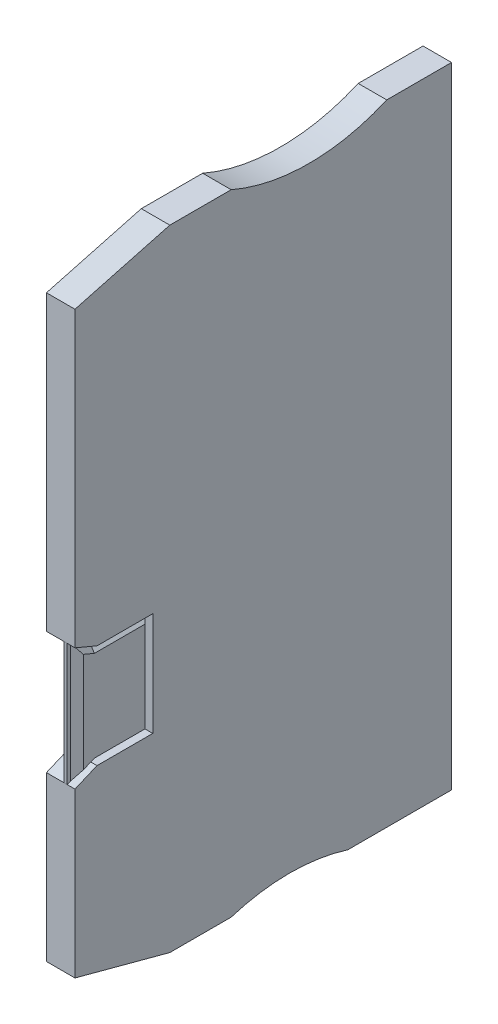
ISO-10303-21;
HEADER;
FILE_DESCRIPTION(('STEP AP214'),'2;1');
FILE_NAME('part.step','',(''),(''),'','','');
FILE_SCHEMA(('AUTOMOTIVE_DESIGN { 1 0 10303 214 1 1 1 1 }'));
ENDSEC;
DATA;
#1=APPLICATION_CONTEXT('core data for automotive mechanical design processes');
#2=APPLICATION_PROTOCOL_DEFINITION('international standard','automotive_design',2000,#1);
#3=PRODUCT_CONTEXT('',#1,'mechanical');
#4=PRODUCT('Part','Part','',(#3));
#5=PRODUCT_RELATED_PRODUCT_CATEGORY('part','',(#4));
#6=PRODUCT_DEFINITION_FORMATION('','',#4);
#7=PRODUCT_DEFINITION_CONTEXT('part definition',#1,'design');
#8=PRODUCT_DEFINITION('design','',#6,#7);
#9=PRODUCT_DEFINITION_SHAPE('','',#8);
#10=(LENGTH_UNIT() NAMED_UNIT(*) SI_UNIT(.MILLI.,.METRE.));
#11=(NAMED_UNIT(*) PLANE_ANGLE_UNIT() SI_UNIT($,.RADIAN.));
#12=(NAMED_UNIT(*) SI_UNIT($,.STERADIAN.) SOLID_ANGLE_UNIT());
#13=UNCERTAINTY_MEASURE_WITH_UNIT(LENGTH_MEASURE(1.E-05),#10,'distance_accuracy_value','');
#14=(GEOMETRIC_REPRESENTATION_CONTEXT(3) GLOBAL_UNCERTAINTY_ASSIGNED_CONTEXT((#13)) GLOBAL_UNIT_ASSIGNED_CONTEXT((#10,
#11,#12)) REPRESENTATION_CONTEXT('',''));
#15=CARTESIAN_POINT('',(0.,0.,0.));
#16=DIRECTION('',(0.,0.,1.));
#17=DIRECTION('',(1.,0.,0.));
#18=AXIS2_PLACEMENT_3D('',#15,#16,#17);
#19=CARTESIAN_POINT('',(0.,24.0184997192853,29.0499999999897));
#20=DIRECTION('',(0.,-0.921109330016461,0.389303997098189));
#21=DIRECTION('',(1.,0.,0.));
#22=AXIS2_PLACEMENT_3D('',#19,#20,#21);
#23=PLANE('',#22);
#24=DIRECTION('',(0.,0.389303997098189,0.921109330016461));
#25=VECTOR('',#24,1.);
#26=CARTESIAN_POINT('',(1.60000000002042,13.5638524803379,4.3138729999976));
#27=LINE('',#26,#25);
#28=CARTESIAN_POINT('',(1.6000000000205,23.2999999999824,27.3499999999967));
#29=VERTEX_POINT('',#28);
#30=CARTESIAN_POINT('',(1.6000000000051,23.9168213078739,28.8094246806752));
#31=VERTEX_POINT('',#30);
#32=EDGE_CURVE('P0_E154',#29,#31,#27,.T.);
#33=ORIENTED_EDGE('',*,*,#32,.F.);
#34=DIRECTION('',(-1.,0.,0.));
#35=VECTOR('',#34,1.);
#36=CARTESIAN_POINT('',(0.,23.3,27.350000000039));
#37=LINE('',#36,#35);
#38=CARTESIAN_POINT('',(1.34999999997115,23.3,27.350000000039));
#39=VERTEX_POINT('',#38);
#40=EDGE_CURVE('P0_E28',#29,#39,#37,.T.);
#41=ORIENTED_EDGE('',*,*,#40,.T.);
#42=DIRECTION('',(0.,0.389303997098189,0.921109330016461));
#43=VECTOR('',#42,1.);
#44=CARTESIAN_POINT('',(1.34999999997091,13.5638524803379,4.3138729999976));
#45=LINE('',#44,#43);
#46=CARTESIAN_POINT('',(1.34999999997371,24.0184997192853,29.0499999999831));
#47=VERTEX_POINT('',#46);
#48=EDGE_CURVE('P0_E208',#39,#47,#45,.T.);
#49=ORIENTED_EDGE('',*,*,#48,.T.);
#50=DIRECTION('',(1.,0.,0.));
#51=VECTOR('',#50,1.);
#52=CARTESIAN_POINT('',(0.,24.0184997192853,29.0499999999897));
#53=LINE('',#52,#51);
#54=CARTESIAN_POINT('',(1.60000000000003,24.0184997192853,29.0499999999897));
#55=VERTEX_POINT('',#54);
#56=EDGE_CURVE('P0_E217',#47,#55,#53,.T.);
#57=ORIENTED_EDGE('',*,*,#56,.T.);
#58=DIRECTION('',(0.,0.389303997098189,0.921109330016461));
#59=VECTOR('',#58,1.);
#60=CARTESIAN_POINT('',(1.59999999999992,13.5638524803379,4.3138729999976));
#61=LINE('',#60,#59);
#62=EDGE_CURVE('P0_E194',#31,#55,#61,.T.);
#63=ORIENTED_EDGE('',*,*,#62,.F.);
#64=EDGE_LOOP('',(#33,#41,#49,#57,#63));
#65=FACE_BOUND('',#64,.T.);
#66=ADVANCED_FACE('P0_F17',(#65),#23,.F.);
#67=CARTESIAN_POINT('',(0.,23.3,23.0499999999897));
#68=DIRECTION('',(0.,0.,1.));
#69=DIRECTION('',(0.,1.,0.));
#70=AXIS2_PLACEMENT_3D('',#67,#68,#69);
#71=PLANE('',#70);
#72=DIRECTION('',(0.,1.,0.));
#73=VECTOR('',#72,1.);
#74=CARTESIAN_POINT('',(1.59999999999974,36.2906041739485,23.0499999999897));
#75=LINE('',#74,#73);
#76=CARTESIAN_POINT('',(1.60000000000007,15.3000000000005,23.0499999999897));
#77=VERTEX_POINT('',#76);
#78=CARTESIAN_POINT('',(1.6,23.3,23.0499999999897));
#79=VERTEX_POINT('',#78);
#80=EDGE_CURVE('P0_E229',#77,#79,#75,.T.);
#81=ORIENTED_EDGE('',*,*,#80,.F.);
#82=DIRECTION('',(-1.,0.,0.));
#83=VECTOR('',#82,1.);
#84=CARTESIAN_POINT('',(0.,15.3000000000005,23.0499999999897));
#85=LINE('',#84,#83);
#86=CARTESIAN_POINT('',(1.35000000000015,15.3000000000005,23.0499999999897));
#87=VERTEX_POINT('',#86);
#88=EDGE_CURVE('P0_E195',#77,#87,#85,.T.);
#89=ORIENTED_EDGE('',*,*,#88,.T.);
#90=DIRECTION('',(0.,1.,0.));
#91=VECTOR('',#90,1.);
#92=CARTESIAN_POINT('',(1.34999999999979,36.2906041739485,23.0499999999897));
#93=LINE('',#92,#91);
#94=CARTESIAN_POINT('',(1.34999999999996,23.3,23.0499999999897));
#95=VERTEX_POINT('',#94);
#96=EDGE_CURVE('P0_E153',#87,#95,#93,.T.);
#97=ORIENTED_EDGE('',*,*,#96,.T.);
#98=DIRECTION('',(-1.,0.,0.));
#99=VECTOR('',#98,1.);
#100=CARTESIAN_POINT('',(0.,23.3,23.0499999999897));
#101=LINE('',#100,#99);
#102=EDGE_CURVE('P0_E11',#79,#95,#101,.T.);
#103=ORIENTED_EDGE('',*,*,#102,.F.);
#104=EDGE_LOOP('',(#81,#89,#97,#103));
#105=FACE_BOUND('',#104,.T.);
#106=ADVANCED_FACE('P0_F366',(#105),#71,.F.);
#107=CARTESIAN_POINT('',(0.,23.3,27.350000000039));
#108=DIRECTION('',(0.,-1.,0.));
#109=DIRECTION('',(1.,0.,0.));
#110=AXIS2_PLACEMENT_3D('',#107,#108,#109);
#111=PLANE('',#110);
#112=DIRECTION('',(0.,0.,1.));
#113=VECTOR('',#112,1.);
#114=CARTESIAN_POINT('',(1.34999999999448,23.3,4.31387299999759));
#115=LINE('',#114,#113);
#116=EDGE_CURVE('P0_E219',#95,#39,#115,.T.);
#117=ORIENTED_EDGE('',*,*,#116,.T.);
#118=ORIENTED_EDGE('',*,*,#40,.F.);
#119=DIRECTION('',(0.,0.,1.));
#120=VECTOR('',#119,1.);
#121=CARTESIAN_POINT('',(1.59999999999985,23.3,4.31387299999759));
#122=LINE('',#121,#120);
#123=EDGE_CURVE('P0_E148',#79,#29,#122,.T.);
#124=ORIENTED_EDGE('',*,*,#123,.F.);
#125=ORIENTED_EDGE('',*,*,#102,.T.);
#126=EDGE_LOOP('',(#117,#118,#124,#125));
#127=FACE_BOUND('',#126,.T.);
#128=ADVANCED_FACE('P0_F364',(#127),#111,.F.);
#129=CARTESIAN_POINT('',(0.,15.3000000000005,23.0499999999897));
#130=DIRECTION('',(0.,1.,0.));
#131=DIRECTION('',(0.,0.,1.));
#132=AXIS2_PLACEMENT_3D('',#129,#130,#131);
#133=PLANE('',#132);
#134=DIRECTION('',(0.,0.,-1.));
#135=VECTOR('',#134,1.);
#136=CARTESIAN_POINT('',(1.59999999999976,15.3000000000007,4.3138729999976));
#137=LINE('',#136,#135);
#138=CARTESIAN_POINT('',(1.60000000000015,15.3000000000005,27.3499999999863));
#139=VERTEX_POINT('',#138);
#140=EDGE_CURVE('P0_E289',#139,#77,#137,.T.);
#141=ORIENTED_EDGE('',*,*,#140,.F.);
#142=DIRECTION('',(-1.,0.,0.));
#143=VECTOR('',#142,1.);
#144=CARTESIAN_POINT('',(0.,15.3000000000005,27.3499999999862));
#145=LINE('',#144,#143);
#146=CARTESIAN_POINT('',(1.35000000000018,15.3000000000005,27.3499999999863));
#147=VERTEX_POINT('',#146);
#148=EDGE_CURVE('P0_E41',#139,#147,#145,.T.);
#149=ORIENTED_EDGE('',*,*,#148,.T.);
#150=DIRECTION('',(0.,0.,-1.));
#151=VECTOR('',#150,1.);
#152=CARTESIAN_POINT('',(1.34999999999997,15.3000000000007,4.3138729999976));
#153=LINE('',#152,#151);
#154=EDGE_CURVE('P0_E223',#147,#87,#153,.T.);
#155=ORIENTED_EDGE('',*,*,#154,.T.);
#156=ORIENTED_EDGE('',*,*,#88,.F.);
#157=EDGE_LOOP('',(#141,#149,#155,#156));
#158=FACE_BOUND('',#157,.T.);
#159=ADVANCED_FACE('P0_F330',(#158),#133,.F.);
#160=CARTESIAN_POINT('',(0.,15.3000000000005,27.3499999999862));
#161=DIRECTION('',(0.,0.92110933002153,0.389303997086196));
#162=DIRECTION('',(-1.,0.,0.));
#163=AXIS2_PLACEMENT_3D('',#160,#161,#162);
#164=PLANE('',#163);
#165=DIRECTION('',(0.,0.389303997086196,-0.92110933002153));
#166=VECTOR('',#165,1.);
#167=CARTESIAN_POINT('',(1.59999999999975,25.036147519287,4.31387299999759));
#168=LINE('',#167,#166);
#169=CARTESIAN_POINT('',(1.60000000000017,14.5815002807191,29.0499999999897));
#170=VERTEX_POINT('',#169);
#171=CARTESIAN_POINT('',(1.60000000000016,14.6831786921247,28.8094246806802));
#172=VERTEX_POINT('',#171);
#173=EDGE_CURVE('P0_E190',#170,#172,#168,.T.);
#174=ORIENTED_EDGE('',*,*,#173,.F.);
#175=DIRECTION('',(-1.,0.,0.));
#176=VECTOR('',#175,1.);
#177=CARTESIAN_POINT('',(0.,14.5815002807191,29.0499999999897));
#178=LINE('',#177,#176);
#179=CARTESIAN_POINT('',(1.35000000000022,14.5815002807191,29.0499999999897));
#180=VERTEX_POINT('',#179);
#181=EDGE_CURVE('P0_E214',#170,#180,#178,.T.);
#182=ORIENTED_EDGE('',*,*,#181,.T.);
#183=DIRECTION('',(0.,0.389303997086196,-0.92110933002153));
#184=VECTOR('',#183,1.);
#185=CARTESIAN_POINT('',(1.34999999999934,25.036147519287,4.31387299999759));
#186=LINE('',#185,#184);
#187=EDGE_CURVE('P0_E212',#180,#147,#186,.T.);
#188=ORIENTED_EDGE('',*,*,#187,.T.);
#189=ORIENTED_EDGE('',*,*,#148,.F.);
#190=DIRECTION('',(0.,0.389303997086196,-0.92110933002153));
#191=VECTOR('',#190,1.);
#192=CARTESIAN_POINT('',(1.60000000000014,25.036147519287,4.31387299999759));
#193=LINE('',#192,#191);
#194=EDGE_CURVE('P0_E193',#172,#139,#193,.T.);
#195=ORIENTED_EDGE('',*,*,#194,.F.);
#196=EDGE_LOOP('',(#174,#182,#188,#189,#195));
#197=FACE_BOUND('',#196,.T.);
#198=ADVANCED_FACE('P0_F331',(#197),#164,.F.);
#199=CARTESIAN_POINT('',(1.70000000000015,15.0572039528669,28.1813341417608));
#200=DIRECTION('',(-0.70710678118657,0.651322653472401,0.275279496282667));
#201=DIRECTION('',(-0.362782249496871,0.,-0.93187393967746));
#202=AXIS2_PLACEMENT_3D('',#199,#200,#201);
#203=PLANE('',#202);
#204=DIRECTION('',(-0.483653557567141,-0.729491927649152,0.483653557567162));
#205=VECTOR('',#204,1.);
#206=CARTESIAN_POINT('',(27.6663066979098,53.9988417783256,2.74311798276939));
#207=LINE('',#206,#205);
#208=CARTESIAN_POINT('',(2.10000000000015,15.4373258665182,28.3094246806802));
#209=VERTEX_POINT('',#208);
#210=EDGE_CURVE('P0_E267',#209,#172,#207,.T.);
#211=ORIENTED_EDGE('',*,*,#210,.T.);
#212=ORIENTED_EDGE('',*,*,#194,.T.);
#213=DIRECTION('',(-0.699957328251262,-0.699957328251265,-0.141843143136023));
#214=VECTOR('',#213,1.);
#215=CARTESIAN_POINT('',(22.5906041739482,36.2906041739485,31.6036496900259));
#216=LINE('',#215,#214);
#217=CARTESIAN_POINT('',(2.10000000000012,15.8000000000004,27.4513227073937));
#218=VERTEX_POINT('',#217);
#219=EDGE_CURVE('P0_E286',#218,#139,#216,.T.);
#220=ORIENTED_EDGE('',*,*,#219,.F.);
#221=DIRECTION('',(0.,0.38930399708618,-0.921109330021536));
#222=VECTOR('',#221,1.);
#223=CARTESIAN_POINT('',(2.09999999999973,25.5789712468329,4.31387299999759));
#224=LINE('',#223,#222);
#225=EDGE_CURVE('P0_E203',#209,#218,#224,.T.);
#226=ORIENTED_EDGE('',*,*,#225,.F.);
#227=EDGE_LOOP('',(#211,#212,#220,#226));
#228=FACE_BOUND('',#227,.T.);
#229=ADVANCED_FACE('P0_F374',(#228),#203,.F.);
#230=CARTESIAN_POINT('',(1.60000000000018,13.6377979368604,29.0499999999897));
#231=DIRECTION('',(-1.,0.,0.));
#232=DIRECTION('',(0.,-1.,0.));
#233=AXIS2_PLACEMENT_3D('',#230,#231,#232);
#234=PLANE('',#233);
#235=ORIENTED_EDGE('',*,*,#62,.T.);
#236=DIRECTION('',(0.,1.,0.));
#237=VECTOR('',#236,1.);
#238=CARTESIAN_POINT('',(1.6000000000002,12.6972720053709,29.0499999999897));
#239=LINE('',#238,#237);
#240=EDGE_CURVE('P0_E216',#170,#55,#239,.T.);
#241=ORIENTED_EDGE('',*,*,#240,.F.);
#242=ORIENTED_EDGE('',*,*,#173,.T.);
#243=DIRECTION('',(0.,1.,0.));
#244=VECTOR('',#243,1.);
#245=CARTESIAN_POINT('',(1.60000000000018,13.6377979368604,28.8094246806802));
#246=LINE('',#245,#244);
#247=EDGE_CURVE('P0_E270',#172,#31,#246,.T.);
#248=ORIENTED_EDGE('',*,*,#247,.T.);
#249=EDGE_LOOP('',(#235,#241,#242,#248));
#250=FACE_BOUND('',#249,.T.);
#251=ADVANCED_FACE('P0_F376',(#250),#234,.F.);
#252=CARTESIAN_POINT('',(1.7,23.2000000000003,23.8202645414694));
#253=DIRECTION('',(-0.707106781186535,-0.70710678118656,0.));
#254=DIRECTION('',(0.70710678118656,-0.707106781186535,0.));
#255=AXIS2_PLACEMENT_3D('',#252,#253,#254);
#256=PLANE('',#255);
#257=ORIENTED_EDGE('',*,*,#123,.T.);
#258=DIRECTION('',(0.699957328250819,-0.699957328250793,0.141843143140535));
#259=VECTOR('',#258,1.);
#260=CARTESIAN_POINT('',(0.,24.9,27.0257673362725));
#261=LINE('',#260,#259);
#262=CARTESIAN_POINT('',(2.1,22.8000000000003,27.4513227073971));
#263=VERTEX_POINT('',#262);
#264=EDGE_CURVE('P0_E141',#29,#263,#261,.T.);
#265=ORIENTED_EDGE('',*,*,#264,.T.);
#266=DIRECTION('',(0.,0.,-1.));
#267=VECTOR('',#266,1.);
#268=CARTESIAN_POINT('',(2.09999999999977,22.8000000000003,4.31387299999759));
#269=LINE('',#268,#267);
#270=CARTESIAN_POINT('',(2.09999999999997,22.8000000000003,23.5499999999897));
#271=VERTEX_POINT('',#270);
#272=EDGE_CURVE('P0_E21',#263,#271,#269,.T.);
#273=ORIENTED_EDGE('',*,*,#272,.T.);
#274=DIRECTION('',(0.577350269189642,-0.577350269189616,0.577350269189619));
#275=VECTOR('',#274,1.);
#276=CARTESIAN_POINT('',(0.,24.9,21.4499999999898));
#277=LINE('',#276,#275);
#278=EDGE_CURVE('P0_E225',#79,#271,#277,.T.);
#279=ORIENTED_EDGE('',*,*,#278,.F.);
#280=EDGE_LOOP('',(#257,#265,#273,#279));
#281=FACE_BOUND('',#280,.T.);
#282=ADVANCED_FACE('P0_F143',(#281),#256,.F.);
#283=CARTESIAN_POINT('',(1.70000000000009,15.4000000000005,23.8202645414687));
#284=DIRECTION('',(-0.707106781186551,0.707106781186545,0.));
#285=DIRECTION('',(0.,0.,-1.));
#286=AXIS2_PLACEMENT_3D('',#283,#284,#285);
#287=PLANE('',#286);
#288=DIRECTION('',(-0.577350269189631,-0.577350269189621,-0.577350269189625));
#289=VECTOR('',#288,1.);
#290=CARTESIAN_POINT('',(0.,13.7000000000004,21.4499999999896));
#291=LINE('',#290,#289);
#292=CARTESIAN_POINT('',(2.10000000000008,15.8000000000005,23.5499999999897));
#293=VERTEX_POINT('',#292);
#294=EDGE_CURVE('P0_E228',#293,#77,#291,.T.);
#295=ORIENTED_EDGE('',*,*,#294,.F.);
#296=DIRECTION('',(0.,0.,1.));
#297=VECTOR('',#296,1.);
#298=CARTESIAN_POINT('',(2.09999999999989,15.8000000000008,4.3138729999976));
#299=LINE('',#298,#297);
#300=EDGE_CURVE('P0_E207',#293,#218,#299,.T.);
#301=ORIENTED_EDGE('',*,*,#300,.T.);
#302=ORIENTED_EDGE('',*,*,#219,.T.);
#303=ORIENTED_EDGE('',*,*,#140,.T.);
#304=EDGE_LOOP('',(#295,#301,#302,#303));
#305=FACE_BOUND('',#304,.T.);
#306=ADVANCED_FACE('P0_F370',(#305),#287,.F.);
#307=CARTESIAN_POINT('',(1.34999999999996,23.3000000000003,23.0499999999897));
#308=DIRECTION('',(-0.707106781186555,0.,-0.70710678118654));
#309=DIRECTION('',(0.70710678118654,0.,-0.707106781186555));
#310=AXIS2_PLACEMENT_3D('',#307,#308,#309);
#311=PLANE('',#310);
#312=ORIENTED_EDGE('',*,*,#96,.F.);
#313=DIRECTION('',(0.57735026918963,-0.577350269189613,-0.577350269189635));
#314=VECTOR('',#313,1.);
#315=CARTESIAN_POINT('',(20.0861269999921,-3.43612699999079,4.3138729999976));
#316=LINE('',#315,#314);
#317=CARTESIAN_POINT('',(0.300000000000081,16.3500000000005,24.0999999999897));
#318=VERTEX_POINT('',#317);
#319=EDGE_CURVE('P0_E213',#318,#87,#316,.T.);
#320=ORIENTED_EDGE('',*,*,#319,.F.);
#321=DIRECTION('',(0.,1.,0.));
#322=VECTOR('',#321,1.);
#323=CARTESIAN_POINT('',(0.299999999999786,36.2906041739485,24.0999999999897));
#324=LINE('',#323,#322);
#325=CARTESIAN_POINT('',(0.299999999999992,22.2500000000054,24.0999999999897));
#326=VERTEX_POINT('',#325);
#327=EDGE_CURVE('P0_E254',#318,#326,#324,.T.);
#328=ORIENTED_EDGE('',*,*,#327,.T.);
#329=DIRECTION('',(0.577350269189611,0.577350269189636,-0.577350269189631));
#330=VECTOR('',#329,1.);
#331=CARTESIAN_POINT('',(14.3406041739424,36.2906041739485,10.0593958260467));
#332=LINE('',#331,#330);
#333=EDGE_CURVE('P0_E261',#326,#95,#332,.T.);
#334=ORIENTED_EDGE('',*,*,#333,.T.);
#335=EDGE_LOOP('',(#312,#320,#328,#334));
#336=FACE_BOUND('',#335,.T.);
#337=ADVANCED_FACE('P0_F347',(#336),#311,.T.);
#338=CARTESIAN_POINT('',(1.70000000000002,23.5427960471457,28.1813341417604));
#339=DIRECTION('',(-0.707106781186528,-0.651322653468854,0.275279496291167));
#340=DIRECTION('',(0.677498316908683,-0.735524323585496,0.));
#341=AXIS2_PLACEMENT_3D('',#338,#339,#340);
#342=PLANE('',#341);
#343=ORIENTED_EDGE('',*,*,#32,.T.);
#344=DIRECTION('',(0.483653557563532,-0.729491927653953,-0.483653557563531));
#345=VECTOR('',#344,1.);
#346=CARTESIAN_POINT('',(-18.3443964596171,53.9988417783248,48.7538211402973));
#347=LINE('',#346,#345);
#348=CARTESIAN_POINT('',(2.10000000000003,23.1626741334943,28.3094246806803));
#349=VERTEX_POINT('',#348);
#350=EDGE_CURVE('P0_E160',#31,#349,#347,.T.);
#351=ORIENTED_EDGE('',*,*,#350,.T.);
#352=DIRECTION('',(0.,0.389303997098188,0.921109330016461));
#353=VECTOR('',#352,1.);
#354=CARTESIAN_POINT('',(2.09999999999993,13.0210287528108,4.3138729999976));
#355=LINE('',#354,#353);
#356=EDGE_CURVE('P0_E157',#263,#349,#355,.T.);
#357=ORIENTED_EDGE('',*,*,#356,.F.);
#358=ORIENTED_EDGE('',*,*,#264,.F.);
#359=EDGE_LOOP('',(#343,#351,#357,#358));
#360=FACE_BOUND('',#359,.T.);
#361=ADVANCED_FACE('P0_F158',(#360),#342,.F.);
#362=CARTESIAN_POINT('',(1.7,19.3000000000004,23.1499999999897));
#363=DIRECTION('',(-0.707106781186539,0.,0.707106781186557));
#364=DIRECTION('',(0.,-1.,0.));
#365=AXIS2_PLACEMENT_3D('',#362,#363,#364);
#366=PLANE('',#365);
#367=ORIENTED_EDGE('',*,*,#80,.T.);
#368=ORIENTED_EDGE('',*,*,#278,.T.);
#369=DIRECTION('',(0.,-1.,0.));
#370=VECTOR('',#369,1.);
#371=CARTESIAN_POINT('',(2.09999999999977,36.2906041739485,23.5499999999897));
#372=LINE('',#371,#370);
#373=EDGE_CURVE('P0_E170',#271,#293,#372,.T.);
#374=ORIENTED_EDGE('',*,*,#373,.T.);
#375=ORIENTED_EDGE('',*,*,#294,.T.);
#376=EDGE_LOOP('',(#367,#368,#374,#375));
#377=FACE_BOUND('',#376,.T.);
#378=ADVANCED_FACE('P0_F367',(#377),#366,.F.);
#379=CARTESIAN_POINT('',(1.60000000000018,13.6377979368604,28.8094246806802));
#380=DIRECTION('',(-0.707106781186555,0.,-0.70710678118654));
#381=DIRECTION('',(0.70710678118654,0.,-0.707106781186555));
#382=AXIS2_PLACEMENT_3D('',#379,#380,#381);
#383=PLANE('',#382);
#384=ORIENTED_EDGE('',*,*,#247,.F.);
#385=ORIENTED_EDGE('',*,*,#210,.F.);
#386=DIRECTION('',(0.,-1.,0.));
#387=VECTOR('',#386,1.);
#388=CARTESIAN_POINT('',(2.09999999999982,36.2906041739485,28.3094246806803));
#389=LINE('',#388,#387);
#390=EDGE_CURVE('P0_E165',#349,#209,#389,.T.);
#391=ORIENTED_EDGE('',*,*,#390,.F.);
#392=ORIENTED_EDGE('',*,*,#350,.F.);
#393=EDGE_LOOP('',(#384,#385,#391,#392));
#394=FACE_BOUND('',#393,.T.);
#395=ADVANCED_FACE('P0_F19',(#394),#383,.F.);
#396=CARTESIAN_POINT('',(0.,23.0047248473125,29.0499999999897));
#397=DIRECTION('',(0.,0.,1.));
#398=DIRECTION('',(0.,1.,0.));
#399=AXIS2_PLACEMENT_3D('',#396,#397,#398);
#400=PLANE('',#399);
#401=ORIENTED_EDGE('',*,*,#56,.F.);
#402=DIRECTION('',(0.,-1.,0.));
#403=VECTOR('',#402,1.);
#404=CARTESIAN_POINT('',(1.35000000000019,12.6972720053709,29.0499999999897));
#405=LINE('',#404,#403);
#406=EDGE_CURVE('P0_E188',#47,#180,#405,.T.);
#407=ORIENTED_EDGE('',*,*,#406,.T.);
#408=ORIENTED_EDGE('',*,*,#181,.F.);
#409=ORIENTED_EDGE('',*,*,#240,.T.);
#410=EDGE_LOOP('',(#401,#407,#408,#409));
#411=FACE_BOUND('',#410,.T.);
#412=ADVANCED_FACE('P0_F310',(#411),#400,.T.);
#413=CARTESIAN_POINT('',(1.35000000000014,15.3000000000005,27.3499999999864));
#414=DIRECTION('',(-0.70710678118654,-0.651322653472438,-0.275279496282657));
#415=DIRECTION('',(0.677498316910694,-0.735524323583644,0.));
#416=AXIS2_PLACEMENT_3D('',#413,#414,#415);
#417=PLANE('',#416);
#418=DIRECTION('',(0.,0.389303997086177,-0.921109330021538));
#419=VECTOR('',#418,1.);
#420=CARTESIAN_POINT('',(0.299999999999728,26.1760773471339,4.31387299999759));
#421=LINE('',#420,#419);
#422=CARTESIAN_POINT('',(0.300000000000134,16.1652093469453,27.9999999999897));
#423=VERTEX_POINT('',#422);
#424=CARTESIAN_POINT('',(0.300000000000126,16.3500000000005,27.5627776855416));
#425=VERTEX_POINT('',#424);
#426=EDGE_CURVE('P0_E281',#423,#425,#421,.T.);
#427=ORIENTED_EDGE('',*,*,#426,.T.);
#428=DIRECTION('',(-0.699957328251284,0.699957328251263,0.141843143135922));
#429=VECTOR('',#428,1.);
#430=CARTESIAN_POINT('',(0.,16.6500000000006,27.6235713099859));
#431=LINE('',#430,#429);
#432=EDGE_CURVE('P0_E230',#147,#425,#431,.T.);
#433=ORIENTED_EDGE('',*,*,#432,.F.);
#434=ORIENTED_EDGE('',*,*,#187,.F.);
#435=DIRECTION('',(-0.483653557567182,0.729491927649126,-0.483653557567161));
#436=VECTOR('',#435,1.);
#437=CARTESIAN_POINT('',(-9.42014840539723,30.8260542561734,18.2798515945927));
#438=LINE('',#437,#436);
#439=EDGE_CURVE('P0_E176',#180,#423,#438,.T.);
#440=ORIENTED_EDGE('',*,*,#439,.T.);
#441=EDGE_LOOP('',(#427,#433,#434,#440));
#442=FACE_BOUND('',#441,.T.);
#443=ADVANCED_FACE('P0_F319',(#442),#417,.T.);
#444=CARTESIAN_POINT('',(1.34999999999652,24.0184997193121,29.0499999999878));
#445=DIRECTION('',(-0.707106781186559,0.651322653468829,-0.275279496291147));
#446=DIRECTION('',(0.362782249506581,0.,-0.93187393967368));
#447=AXIS2_PLACEMENT_3D('',#444,#445,#446);
#448=PLANE('',#447);
#449=ORIENTED_EDGE('',*,*,#48,.F.);
#450=DIRECTION('',(0.699957328250791,0.699957328250815,-0.141843143140568));
#451=VECTOR('',#450,1.);
#452=CARTESIAN_POINT('',(14.3406041739426,36.2906041739485,24.7175136283697));
#453=LINE('',#452,#451);
#454=CARTESIAN_POINT('',(0.300000000000037,22.2500000000054,27.5627776855395));
#455=VERTEX_POINT('',#454);
#456=EDGE_CURVE('P0_E224',#455,#39,#453,.T.);
#457=ORIENTED_EDGE('',*,*,#456,.F.);
#458=DIRECTION('',(0.,0.389303997098184,0.921109330016463));
#459=VECTOR('',#458,1.);
#460=CARTESIAN_POINT('',(0.299999999999938,12.4239226525158,4.3138729999976));
#461=LINE('',#460,#459);
#462=CARTESIAN_POINT('',(0.30000000000004,22.4347906530682,27.9999999999897));
#463=VERTEX_POINT('',#462);
#464=EDGE_CURVE('P0_E202',#455,#463,#461,.T.);
#465=ORIENTED_EDGE('',*,*,#464,.T.);
#466=DIRECTION('',(-0.483653557563518,-0.729491927653969,-0.48365355756352));
#467=VECTOR('',#466,1.);
#468=CARTESIAN_POINT('',(-4.69680973848055,14.8981307624488,23.0031902615091));
#469=LINE('',#468,#467);
#470=EDGE_CURVE('P0_E184',#47,#463,#469,.T.);
#471=ORIENTED_EDGE('',*,*,#470,.F.);
#472=EDGE_LOOP('',(#449,#457,#465,#471));
#473=FACE_BOUND('',#472,.T.);
#474=ADVANCED_FACE('P0_F341',(#473),#448,.T.);
#475=CARTESIAN_POINT('',(1.35000000000007,15.3000000000006,20.0499999999881));
#476=DIRECTION('',(-0.707106781186537,-0.707106781186558,0.));
#477=DIRECTION('',(0.707106781186558,-0.707106781186537,0.));
#478=AXIS2_PLACEMENT_3D('',#475,#476,#477);
#479=PLANE('',#478);
#480=ORIENTED_EDGE('',*,*,#154,.F.);
#481=ORIENTED_EDGE('',*,*,#432,.T.);
#482=DIRECTION('',(0.,0.,-1.));
#483=VECTOR('',#482,1.);
#484=CARTESIAN_POINT('',(0.299999999999878,16.3500000000007,4.3138729999976));
#485=LINE('',#484,#483);
#486=EDGE_CURVE('P0_E275',#425,#318,#485,.T.);
#487=ORIENTED_EDGE('',*,*,#486,.T.);
#488=ORIENTED_EDGE('',*,*,#319,.T.);
#489=EDGE_LOOP('',(#480,#481,#487,#488));
#490=FACE_BOUND('',#489,.T.);
#491=ADVANCED_FACE('P0_F327',(#490),#479,.T.);
#492=CARTESIAN_POINT('',(1.34999999999942,23.3000000000049,27.3499999999865));
#493=DIRECTION('',(-0.707106781186558,0.707106781186537,0.));
#494=DIRECTION('',(0.,0.,-1.));
#495=AXIS2_PLACEMENT_3D('',#492,#493,#494);
#496=PLANE('',#495);
#497=ORIENTED_EDGE('',*,*,#333,.F.);
#498=DIRECTION('',(0.,0.,1.));
#499=VECTOR('',#498,1.);
#500=CARTESIAN_POINT('',(0.299999999999788,22.2500000000055,4.31387299999759));
#501=LINE('',#500,#499);
#502=EDGE_CURVE('P0_E250',#326,#455,#501,.T.);
#503=ORIENTED_EDGE('',*,*,#502,.T.);
#504=ORIENTED_EDGE('',*,*,#456,.T.);
#505=ORIENTED_EDGE('',*,*,#116,.F.);
#506=EDGE_LOOP('',(#497,#503,#504,#505));
#507=FACE_BOUND('',#506,.T.);
#508=ADVANCED_FACE('P0_F343',(#507),#496,.T.);
#509=CARTESIAN_POINT('',(2.09999999999935,53.9988417783252,8.88687099998869));
#510=DIRECTION('',(1.,0.,0.));
#511=DIRECTION('',(0.,1.,0.));
#512=AXIS2_PLACEMENT_3D('',#509,#510,#511);
#513=PLANE('',#512);
#514=ORIENTED_EDGE('',*,*,#373,.F.);
#515=ORIENTED_EDGE('',*,*,#272,.F.);
#516=ORIENTED_EDGE('',*,*,#356,.T.);
#517=ORIENTED_EDGE('',*,*,#390,.T.);
#518=ORIENTED_EDGE('',*,*,#225,.T.);
#519=ORIENTED_EDGE('',*,*,#300,.F.);
#520=EDGE_LOOP('',(#514,#515,#516,#517,#518,#519));
#521=FACE_BOUND('',#520,.T.);
#522=ADVANCED_FACE('P0_F167',(#521),#513,.T.);
#523=CARTESIAN_POINT('',(0.946570810573318,18.0092102373062,28.6465708105628));
#524=DIRECTION('',(-0.707106781186541,0.,0.707106781186555));
#525=DIRECTION('',(0.,-1.,0.));
#526=AXIS2_PLACEMENT_3D('',#523,#524,#525);
#527=PLANE('',#526);
#528=ORIENTED_EDGE('',*,*,#406,.F.);
#529=ORIENTED_EDGE('',*,*,#470,.T.);
#530=DIRECTION('',(0.,-1.,0.));
#531=VECTOR('',#530,1.);
#532=CARTESIAN_POINT('',(0.299999999999828,36.2906041739485,27.9999999999897));
#533=LINE('',#532,#531);
#534=EDGE_CURVE('P0_E198',#463,#423,#533,.T.);
#535=ORIENTED_EDGE('',*,*,#534,.T.);
#536=ORIENTED_EDGE('',*,*,#439,.F.);
#537=EDGE_LOOP('',(#528,#529,#535,#536));
#538=FACE_BOUND('',#537,.T.);
#539=ADVANCED_FACE('P0_F314',(#538),#527,.T.);
#540=CARTESIAN_POINT('',(0.300000000000058,19.2660100291633,25.2294992131586));
#541=DIRECTION('',(-1.,0.,0.));
#542=DIRECTION('',(0.,-1.,0.));
#543=AXIS2_PLACEMENT_3D('',#540,#541,#542);
#544=PLANE('',#543);
#545=ORIENTED_EDGE('',*,*,#534,.F.);
#546=ORIENTED_EDGE('',*,*,#464,.F.);
#547=ORIENTED_EDGE('',*,*,#502,.F.);
#548=ORIENTED_EDGE('',*,*,#327,.F.);
#549=ORIENTED_EDGE('',*,*,#486,.F.);
#550=ORIENTED_EDGE('',*,*,#426,.F.);
#551=EDGE_LOOP('',(#545,#546,#547,#548,#549,#550));
#552=FACE_BOUND('',#551,.T.);
#553=ADVANCED_FACE('P0_F321',(#552),#544,.T.);
#554=CLOSED_SHELL('',(#66,#106,#128,#159,#198,#229,#251,#282,#306,#337,#361,#378,#395,#412,#443,
#474,#491,#508,#522,#539,#553));
#555=MANIFOLD_SOLID_BREP('P0_B1',#554);
#556=CARTESIAN_POINT('',(0.,-14.3090880212542,12.4999999999886));
#557=DIRECTION('',(1.,0.,0.));
#558=DIRECTION('',(0.,1.,0.));
#559=AXIS2_PLACEMENT_3D('',#556,#557,#558);
#560=CYLINDRICAL_SURFACE('',#559,15.);
#561=DIRECTION('',(1.,0.,0.));
#562=VECTOR('',#561,1.);
#563=CARTESIAN_POINT('',(0.,0.,7.9999999999887));
#564=LINE('',#563,#562);
#565=CARTESIAN_POINT('',(0.,0.,7.9999999999887));
#566=VERTEX_POINT('',#565);
#567=CARTESIAN_POINT('',(2.2,0.,7.9999999999887));
#568=VERTEX_POINT('',#567);
#569=EDGE_CURVE('P1_E10',#566,#568,#564,.T.);
#570=ORIENTED_EDGE('',*,*,#569,.T.);
#571=CARTESIAN_POINT('',(2.2,-14.3090880212542,12.4999999999886));
#572=DIRECTION('',(1.,0.,0.));
#573=DIRECTION('',(0.,1.,0.));
#574=AXIS2_PLACEMENT_3D('',#571,#572,#573);
#575=CIRCLE('',#574,15.);
#576=CARTESIAN_POINT('',(2.2,0.,16.9999999999886));
#577=VERTEX_POINT('',#576);
#578=EDGE_CURVE('P1_E151',#568,#577,#575,.T.);
#579=ORIENTED_EDGE('',*,*,#578,.T.);
#580=DIRECTION('',(1.,0.,0.));
#581=VECTOR('',#580,1.);
#582=CARTESIAN_POINT('',(0.,0.,16.9999999999886));
#583=LINE('',#582,#581);
#584=CARTESIAN_POINT('',(0.,0.,16.9999999999886));
#585=VERTEX_POINT('',#584);
#586=EDGE_CURVE('P1_E218',#585,#577,#583,.T.);
#587=ORIENTED_EDGE('',*,*,#586,.F.);
#588=CARTESIAN_POINT('',(0.,-14.3090880212542,12.4999999999886));
#589=DIRECTION('',(1.,0.,0.));
#590=DIRECTION('',(0.,1.,0.));
#591=AXIS2_PLACEMENT_3D('',#588,#589,#590);
#592=CIRCLE('',#591,15.);
#593=EDGE_CURVE('P1_E154',#566,#585,#592,.T.);
#594=ORIENTED_EDGE('',*,*,#593,.F.);
#595=EDGE_LOOP('',(#570,#579,#587,#594));
#596=FACE_BOUND('',#595,.T.);
#597=ADVANCED_FACE('P1_F16',(#596),#560,.F.);
#598=CARTESIAN_POINT('',(0.,23.0047248473124,29.0499999999898));
#599=DIRECTION('',(0.,0.,1.));
#600=DIRECTION('',(0.,1.,0.));
#601=AXIS2_PLACEMENT_3D('',#598,#599,#600);
#602=PLANE('',#601);
#603=DIRECTION('',(0.,-1.,0.));
#604=VECTOR('',#603,1.);
#605=CARTESIAN_POINT('',(0.,36.2906041739484,29.0499999999898));
#606=LINE('',#605,#604);
#607=CARTESIAN_POINT('',(0.,14.5815002807191,29.0499999999898));
#608=VERTEX_POINT('',#607);
#609=CARTESIAN_POINT('',(0.,1.96019422934681,29.0499999999898));
#610=VERTEX_POINT('',#609);
#611=EDGE_CURVE('P1_E194',#608,#610,#606,.T.);
#612=ORIENTED_EDGE('',*,*,#611,.T.);
#613=DIRECTION('',(1.,0.,0.));
#614=VECTOR('',#613,1.);
#615=CARTESIAN_POINT('',(0.,1.96019422934681,29.0499999999898));
#616=LINE('',#615,#614);
#617=CARTESIAN_POINT('',(2.2,1.96019422934681,29.0499999999898));
#618=VERTEX_POINT('',#617);
#619=EDGE_CURVE('P1_E20',#610,#618,#616,.T.);
#620=ORIENTED_EDGE('',*,*,#619,.T.);
#621=DIRECTION('',(0.,1.,0.));
#622=VECTOR('',#621,1.);
#623=CARTESIAN_POINT('',(2.2,36.2906041739484,29.0499999999898));
#624=LINE('',#623,#622);
#625=CARTESIAN_POINT('',(2.2,14.5815002807191,29.0499999999898));
#626=VERTEX_POINT('',#625);
#627=EDGE_CURVE('P1_E191',#618,#626,#624,.T.);
#628=ORIENTED_EDGE('',*,*,#627,.T.);
#629=DIRECTION('',(-1.,0.,0.));
#630=VECTOR('',#629,1.);
#631=CARTESIAN_POINT('',(0.,14.5815002807191,29.0499999999898));
#632=LINE('',#631,#630);
#633=EDGE_CURVE('P1_E250',#626,#608,#632,.T.);
#634=ORIENTED_EDGE('',*,*,#633,.T.);
#635=EDGE_LOOP('',(#612,#620,#628,#634));
#636=FACE_BOUND('',#635,.T.);
#637=ADVANCED_FACE('P1_F400',(#636),#602,.T.);
#638=CARTESIAN_POINT('',(0.,23.0047248473124,29.0499999999898));
#639=DIRECTION('',(0.,0.,1.));
#640=DIRECTION('',(0.,1.,0.));
#641=AXIS2_PLACEMENT_3D('',#638,#639,#640);
#642=PLANE('',#641);
#643=DIRECTION('',(1.,0.,0.));
#644=VECTOR('',#643,1.);
#645=CARTESIAN_POINT('',(0.,24.0184997192853,29.0499999999898));
#646=LINE('',#645,#644);
#647=CARTESIAN_POINT('',(0.,24.0184997192853,29.0499999999898));
#648=VERTEX_POINT('',#647);
#649=CARTESIAN_POINT('',(2.2,24.0184997192853,29.0499999999898));
#650=VERTEX_POINT('',#649);
#651=EDGE_CURVE('P1_E308',#648,#650,#646,.T.);
#652=ORIENTED_EDGE('',*,*,#651,.T.);
#653=DIRECTION('',(0.,1.,0.));
#654=VECTOR('',#653,1.);
#655=CARTESIAN_POINT('',(2.2,36.2906041739484,29.0499999999898));
#656=LINE('',#655,#654);
#657=CARTESIAN_POINT('',(2.2,46.6398057706538,29.0499999999898));
#658=VERTEX_POINT('',#657);
#659=EDGE_CURVE('P1_E228',#650,#658,#656,.T.);
#660=ORIENTED_EDGE('',*,*,#659,.T.);
#661=DIRECTION('',(1.,0.,0.));
#662=VECTOR('',#661,1.);
#663=CARTESIAN_POINT('',(0.,46.6398057706538,29.0499999999898));
#664=LINE('',#663,#662);
#665=CARTESIAN_POINT('',(0.,46.6398057706538,29.0499999999898));
#666=VERTEX_POINT('',#665);
#667=EDGE_CURVE('P1_E27',#666,#658,#664,.T.);
#668=ORIENTED_EDGE('',*,*,#667,.F.);
#669=DIRECTION('',(0.,-1.,0.));
#670=VECTOR('',#669,1.);
#671=CARTESIAN_POINT('',(0.,36.2906041739484,29.0499999999898));
#672=LINE('',#671,#670);
#673=EDGE_CURVE('P1_E185',#666,#648,#672,.T.);
#674=ORIENTED_EDGE('',*,*,#673,.T.);
#675=EDGE_LOOP('',(#652,#660,#668,#674));
#676=FACE_BOUND('',#675,.T.);
#677=ADVANCED_FACE('P1_F365',(#676),#642,.T.);
#678=CARTESIAN_POINT('',(2.2,23.3,27.3500000000391));
#679=DIRECTION('',(0.,-1.,0.));
#680=DIRECTION('',(1.,0.,0.));
#681=AXIS2_PLACEMENT_3D('',#678,#679,#680);
#682=PLANE('',#681);
#683=DIRECTION('',(0.,0.,-1.));
#684=VECTOR('',#683,1.);
#685=CARTESIAN_POINT('',(2.2,23.3,4.31387299999771));
#686=LINE('',#685,#684);
#687=CARTESIAN_POINT('',(2.2,23.3,27.3500000000391));
#688=VERTEX_POINT('',#687);
#689=CARTESIAN_POINT('',(2.2,23.3,23.0499999999897));
#690=VERTEX_POINT('',#689);
#691=EDGE_CURVE('P1_E192',#688,#690,#686,.T.);
#692=ORIENTED_EDGE('',*,*,#691,.F.);
#693=DIRECTION('',(1.,0.,0.));
#694=VECTOR('',#693,1.);
#695=CARTESIAN_POINT('',(0.,23.3,27.3500000000391));
#696=LINE('',#695,#694);
#697=CARTESIAN_POINT('',(0.,23.3,27.3500000000391));
#698=VERTEX_POINT('',#697);
#699=EDGE_CURVE('P1_E215',#698,#688,#696,.T.);
#700=ORIENTED_EDGE('',*,*,#699,.F.);
#701=DIRECTION('',(0.,0.,1.));
#702=VECTOR('',#701,1.);
#703=CARTESIAN_POINT('',(0.,23.3,4.31387299999771));
#704=LINE('',#703,#702);
#705=CARTESIAN_POINT('',(0.,23.3,23.0499999999897));
#706=VERTEX_POINT('',#705);
#707=EDGE_CURVE('P1_E183',#706,#698,#704,.T.);
#708=ORIENTED_EDGE('',*,*,#707,.F.);
#709=DIRECTION('',(1.,0.,0.));
#710=VECTOR('',#709,1.);
#711=CARTESIAN_POINT('',(0.,23.3,23.0499999999897));
#712=LINE('',#711,#710);
#713=EDGE_CURVE('P1_E213',#706,#690,#712,.T.);
#714=ORIENTED_EDGE('',*,*,#713,.T.);
#715=EDGE_LOOP('',(#692,#700,#708,#714));
#716=FACE_BOUND('',#715,.T.);
#717=ADVANCED_FACE('P1_F447',(#716),#682,.T.);
#718=CARTESIAN_POINT('',(0.,0.,-1.0096812275151E-11));
#719=DIRECTION('',(0.,-1.,0.));
#720=DIRECTION('',(1.,0.,0.));
#721=AXIS2_PLACEMENT_3D('',#718,#719,#720);
#722=PLANE('',#721);
#723=DIRECTION('',(0.,0.,1.));
#724=VECTOR('',#723,1.);
#725=CARTESIAN_POINT('',(2.2,0.,4.3138729999977));
#726=LINE('',#725,#724);
#727=CARTESIAN_POINT('',(2.2,0.,-1.98951966012828E-13));
#728=VERTEX_POINT('',#727);
#729=EDGE_CURVE('P1_E157',#728,#568,#726,.T.);
#730=ORIENTED_EDGE('',*,*,#729,.T.);
#731=ORIENTED_EDGE('',*,*,#569,.F.);
#732=DIRECTION('',(0.,0.,1.));
#733=VECTOR('',#732,1.);
#734=CARTESIAN_POINT('',(0.,0.,4.3138729999977));
#735=LINE('',#734,#733);
#736=CARTESIAN_POINT('',(0.,0.,-1.98951966012828E-13));
#737=VERTEX_POINT('',#736);
#738=EDGE_CURVE('P1_E222',#737,#566,#735,.T.);
#739=ORIENTED_EDGE('',*,*,#738,.F.);
#740=DIRECTION('',(-1.,0.,0.));
#741=VECTOR('',#740,1.);
#742=CARTESIAN_POINT('',(0.,0.,-1.98951966012828E-13));
#743=LINE('',#742,#741);
#744=EDGE_CURVE('P1_E160',#728,#737,#743,.T.);
#745=ORIENTED_EDGE('',*,*,#744,.F.);
#746=EDGE_LOOP('',(#730,#731,#739,#745));
#747=FACE_BOUND('',#746,.T.);
#748=ADVANCED_FACE('P1_F158',(#747),#722,.T.);
#749=CARTESIAN_POINT('',(0.,46.639805770654,29.0499999999892));
#750=DIRECTION('',(0.,0.96592582628891,0.258819045103111));
#751=DIRECTION('',(-1.,0.,0.));
#752=AXIS2_PLACEMENT_3D('',#749,#750,#751);
#753=PLANE('',#752);
#754=ORIENTED_EDGE('',*,*,#667,.T.);
#755=DIRECTION('',(0.,0.258819045103111,-0.96592582628891));
#756=VECTOR('',#755,1.);
#757=CARTESIAN_POINT('',(2.2,53.2678310241916,4.31387299999771));
#758=LINE('',#757,#756);
#759=CARTESIAN_POINT('',(2.2,48.6,21.7344555433836));
#760=VERTEX_POINT('',#759);
#761=EDGE_CURVE('P1_E231',#658,#760,#758,.T.);
#762=ORIENTED_EDGE('',*,*,#761,.T.);
#763=DIRECTION('',(1.,0.,0.));
#764=VECTOR('',#763,1.);
#765=CARTESIAN_POINT('',(0.,48.6,21.7344555433836));
#766=LINE('',#765,#764);
#767=CARTESIAN_POINT('',(0.,48.6,21.7344555433836));
#768=VERTEX_POINT('',#767);
#769=EDGE_CURVE('P1_E245',#768,#760,#766,.T.);
#770=ORIENTED_EDGE('',*,*,#769,.F.);
#771=DIRECTION('',(0.,0.258819045103111,-0.96592582628891));
#772=VECTOR('',#771,1.);
#773=CARTESIAN_POINT('',(0.,53.2678310241916,4.31387299999771));
#774=LINE('',#773,#772);
#775=EDGE_CURVE('P1_E220',#666,#768,#774,.T.);
#776=ORIENTED_EDGE('',*,*,#775,.F.);
#777=EDGE_LOOP('',(#754,#762,#770,#776));
#778=FACE_BOUND('',#777,.T.);
#779=ADVANCED_FACE('P1_F377',(#778),#753,.T.);
#780=CARTESIAN_POINT('',(2.2,15.3000000000005,23.0499999999897));
#781=DIRECTION('',(0.,1.,0.));
#782=DIRECTION('',(0.,0.,1.));
#783=AXIS2_PLACEMENT_3D('',#780,#781,#782);
#784=PLANE('',#783);
#785=DIRECTION('',(0.,0.,1.));
#786=VECTOR('',#785,1.);
#787=CARTESIAN_POINT('',(2.2,15.3000000000006,4.3138729999977));
#788=LINE('',#787,#786);
#789=CARTESIAN_POINT('',(2.2,15.3000000000005,23.0499999999898));
#790=VERTEX_POINT('',#789);
#791=CARTESIAN_POINT('',(2.2,15.3000000000004,27.3499999999863));
#792=VERTEX_POINT('',#791);
#793=EDGE_CURVE('P1_E189',#790,#792,#788,.T.);
#794=ORIENTED_EDGE('',*,*,#793,.F.);
#795=DIRECTION('',(1.,0.,0.));
#796=VECTOR('',#795,1.);
#797=CARTESIAN_POINT('',(0.,15.3000000000004,23.0499999999898));
#798=LINE('',#797,#796);
#799=CARTESIAN_POINT('',(0.,15.3000000000004,23.0499999999897));
#800=VERTEX_POINT('',#799);
#801=EDGE_CURVE('P1_E241',#800,#790,#798,.T.);
#802=ORIENTED_EDGE('',*,*,#801,.F.);
#803=DIRECTION('',(0.,0.,-1.));
#804=VECTOR('',#803,1.);
#805=CARTESIAN_POINT('',(0.,15.3000000000006,4.3138729999977));
#806=LINE('',#805,#804);
#807=CARTESIAN_POINT('',(0.,15.3000000000004,27.3499999999864));
#808=VERTEX_POINT('',#807);
#809=EDGE_CURVE('P1_E186',#808,#800,#806,.T.);
#810=ORIENTED_EDGE('',*,*,#809,.F.);
#811=DIRECTION('',(1.,0.,0.));
#812=VECTOR('',#811,1.);
#813=CARTESIAN_POINT('',(0.,15.3000000000004,27.3499999999863));
#814=LINE('',#813,#812);
#815=EDGE_CURVE('P1_E232',#808,#792,#814,.T.);
#816=ORIENTED_EDGE('',*,*,#815,.T.);
#817=EDGE_LOOP('',(#794,#802,#810,#816));
#818=FACE_BOUND('',#817,.T.);
#819=ADVANCED_FACE('P1_F429',(#818),#784,.T.);
#820=CARTESIAN_POINT('',(0.,52.8132707783241,-2.9050024000042));
#821=DIRECTION('',(1.,0.,0.));
#822=DIRECTION('',(0.,1.,0.));
#823=AXIS2_PLACEMENT_3D('',#820,#821,#822);
#824=PLANE('',#823);
#825=ORIENTED_EDGE('',*,*,#611,.F.);
#826=DIRECTION('',(0.,0.389303997086196,-0.92110933002153));
#827=VECTOR('',#826,1.);
#828=CARTESIAN_POINT('',(0.,25.0361475192869,4.31387299999771));
#829=LINE('',#828,#827);
#830=EDGE_CURVE('P1_E236',#608,#808,#829,.T.);
#831=ORIENTED_EDGE('',*,*,#830,.T.);
#832=ORIENTED_EDGE('',*,*,#809,.T.);
#833=DIRECTION('',(0.,1.,0.));
#834=VECTOR('',#833,1.);
#835=CARTESIAN_POINT('',(0.,36.2906041739484,23.0499999999897));
#836=LINE('',#835,#834);
#837=EDGE_CURVE('P1_E238',#800,#706,#836,.T.);
#838=ORIENTED_EDGE('',*,*,#837,.T.);
#839=ORIENTED_EDGE('',*,*,#707,.T.);
#840=DIRECTION('',(0.,0.389303997098189,0.921109330016461));
#841=VECTOR('',#840,1.);
#842=CARTESIAN_POINT('',(0.,13.5638524803378,4.3138729999977));
#843=LINE('',#842,#841);
#844=EDGE_CURVE('P1_E219',#698,#648,#843,.T.);
#845=ORIENTED_EDGE('',*,*,#844,.T.);
#846=ORIENTED_EDGE('',*,*,#673,.F.);
#847=ORIENTED_EDGE('',*,*,#775,.T.);
#848=DIRECTION('',(0.,0.,-1.));
#849=VECTOR('',#848,1.);
#850=CARTESIAN_POINT('',(0.,48.6,4.31387299999771));
#851=LINE('',#850,#849);
#852=CARTESIAN_POINT('',(0.,48.6,16.999999999995));
#853=VERTEX_POINT('',#852);
#854=EDGE_CURVE('P1_E277',#768,#853,#851,.T.);
#855=ORIENTED_EDGE('',*,*,#854,.T.);
#856=CARTESIAN_POINT('',(0.,62.3477270848677,10.999999999995));
#857=DIRECTION('',(1.,0.,0.));
#858=DIRECTION('',(0.,1.,0.));
#859=AXIS2_PLACEMENT_3D('',#856,#857,#858);
#860=CIRCLE('',#859,15.);
#861=CARTESIAN_POINT('',(0.,48.6,4.99999999999501));
#862=VERTEX_POINT('',#861);
#863=EDGE_CURVE('P1_E282',#853,#862,#860,.T.);
#864=ORIENTED_EDGE('',*,*,#863,.T.);
#865=DIRECTION('',(0.,0.,-1.));
#866=VECTOR('',#865,1.);
#867=CARTESIAN_POINT('',(0.,48.6,4.31387299999771));
#868=LINE('',#867,#866);
#869=CARTESIAN_POINT('',(0.,48.6,-1.91846538655227E-13));
#870=VERTEX_POINT('',#869);
#871=EDGE_CURVE('P1_E262',#862,#870,#868,.T.);
#872=ORIENTED_EDGE('',*,*,#871,.T.);
#873=DIRECTION('',(0.,-1.,0.));
#874=VECTOR('',#873,1.);
#875=CARTESIAN_POINT('',(0.,36.2906041739484,-1.91846538655227E-13));
#876=LINE('',#875,#874);
#877=EDGE_CURVE('P1_E181',#870,#737,#876,.T.);
#878=ORIENTED_EDGE('',*,*,#877,.T.);
#879=ORIENTED_EDGE('',*,*,#738,.T.);
#880=ORIENTED_EDGE('',*,*,#593,.T.);
#881=DIRECTION('',(0.,0.,1.));
#882=VECTOR('',#881,1.);
#883=CARTESIAN_POINT('',(0.,0.,4.3138729999977));
#884=LINE('',#883,#882);
#885=CARTESIAN_POINT('',(0.,0.,21.7344555433821));
#886=VERTEX_POINT('',#885);
#887=EDGE_CURVE('P1_E312',#585,#886,#884,.T.);
#888=ORIENTED_EDGE('',*,*,#887,.T.);
#889=DIRECTION('',(0.,0.258819045103118,0.965925826288908));
#890=VECTOR('',#889,1.);
#891=CARTESIAN_POINT('',(0.,-4.66783102419114,4.3138729999977));
#892=LINE('',#891,#890);
#893=EDGE_CURVE('P1_E244',#886,#610,#892,.T.);
#894=ORIENTED_EDGE('',*,*,#893,.T.);
#895=EDGE_LOOP('',(#825,#831,#832,#838,#839,#845,#846,#847,#855,#864,#872,#878,#879,#880,#888,#894));
#896=FACE_BOUND('',#895,.T.);
#897=ADVANCED_FACE('P1_F348',(#896),#824,.F.);
#898=CARTESIAN_POINT('',(1.4,-3.39999999999222,-1.98951966012828E-13));
#899=DIRECTION('',(0.,0.,-1.));
#900=DIRECTION('',(-1.,0.,0.));
#901=AXIS2_PLACEMENT_3D('',#898,#899,#900);
#902=PLANE('',#901);
#903=DIRECTION('',(0.,-1.,0.));
#904=VECTOR('',#903,1.);
#905=CARTESIAN_POINT('',(2.2,36.2906041739484,-1.91846538655227E-13));
#906=LINE('',#905,#904);
#907=CARTESIAN_POINT('',(2.2,48.6,-1.91846538655227E-13));
#908=VERTEX_POINT('',#907);
#909=EDGE_CURVE('P1_E164',#908,#728,#906,.T.);
#910=ORIENTED_EDGE('',*,*,#909,.T.);
#911=ORIENTED_EDGE('',*,*,#744,.T.);
#912=ORIENTED_EDGE('',*,*,#877,.F.);
#913=DIRECTION('',(-1.,0.,0.));
#914=VECTOR('',#913,1.);
#915=CARTESIAN_POINT('',(0.,48.6,-1.91846538655227E-13));
#916=LINE('',#915,#914);
#917=EDGE_CURVE('P1_E267',#908,#870,#916,.T.);
#918=ORIENTED_EDGE('',*,*,#917,.F.);
#919=EDGE_LOOP('',(#910,#911,#912,#918));
#920=FACE_BOUND('',#919,.T.);
#921=ADVANCED_FACE('P1_F347',(#920),#902,.T.);
#922=CARTESIAN_POINT('',(0.,-0.0120025447582979,21.6896614365243));
#923=DIRECTION('',(0.,-0.965925826288908,0.258819045103118));
#924=DIRECTION('',(1.,0.,0.));
#925=AXIS2_PLACEMENT_3D('',#922,#923,#924);
#926=PLANE('',#925);
#927=DIRECTION('',(1.,0.,0.));
#928=VECTOR('',#927,1.);
#929=CARTESIAN_POINT('',(0.,0.,21.7344555433821));
#930=LINE('',#929,#928);
#931=CARTESIAN_POINT('',(2.2,0.,21.7344555433821));
#932=VERTEX_POINT('',#931);
#933=EDGE_CURVE('P1_E311',#886,#932,#930,.T.);
#934=ORIENTED_EDGE('',*,*,#933,.T.);
#935=DIRECTION('',(0.,0.258819045103118,0.965925826288908));
#936=VECTOR('',#935,1.);
#937=CARTESIAN_POINT('',(2.2,-4.66783102419114,4.3138729999977));
#938=LINE('',#937,#936);
#939=EDGE_CURVE('P1_E177',#932,#618,#938,.T.);
#940=ORIENTED_EDGE('',*,*,#939,.T.);
#941=ORIENTED_EDGE('',*,*,#619,.F.);
#942=ORIENTED_EDGE('',*,*,#893,.F.);
#943=EDGE_LOOP('',(#934,#940,#941,#942));
#944=FACE_BOUND('',#943,.T.);
#945=ADVANCED_FACE('P1_F319',(#944),#926,.T.);
#946=CARTESIAN_POINT('',(0.,0.,16.9999999999886));
#947=DIRECTION('',(0.,-1.,0.));
#948=DIRECTION('',(1.,0.,0.));
#949=AXIS2_PLACEMENT_3D('',#946,#947,#948);
#950=PLANE('',#949);
#951=ORIENTED_EDGE('',*,*,#586,.T.);
#952=DIRECTION('',(0.,0.,1.));
#953=VECTOR('',#952,1.);
#954=CARTESIAN_POINT('',(2.2,0.,4.3138729999977));
#955=LINE('',#954,#953);
#956=EDGE_CURVE('P1_E170',#577,#932,#955,.T.);
#957=ORIENTED_EDGE('',*,*,#956,.T.);
#958=ORIENTED_EDGE('',*,*,#933,.F.);
#959=ORIENTED_EDGE('',*,*,#887,.F.);
#960=EDGE_LOOP('',(#951,#957,#958,#959));
#961=FACE_BOUND('',#960,.T.);
#962=ADVANCED_FACE('P1_F324',(#961),#950,.T.);
#963=CARTESIAN_POINT('',(2.2,24.0184997192853,29.0499999999897));
#964=DIRECTION('',(0.,-0.921109330016461,0.389303997098189));
#965=DIRECTION('',(1.,0.,0.));
#966=AXIS2_PLACEMENT_3D('',#963,#964,#965);
#967=PLANE('',#966);
#968=DIRECTION('',(0.,-0.389303997098189,-0.921109330016461));
#969=VECTOR('',#968,1.);
#970=CARTESIAN_POINT('',(2.2,13.5638524803378,4.3138729999977));
#971=LINE('',#970,#969);
#972=EDGE_CURVE('P1_E224',#650,#688,#971,.T.);
#973=ORIENTED_EDGE('',*,*,#972,.F.);
#974=ORIENTED_EDGE('',*,*,#651,.F.);
#975=ORIENTED_EDGE('',*,*,#844,.F.);
#976=ORIENTED_EDGE('',*,*,#699,.T.);
#977=EDGE_LOOP('',(#973,#974,#975,#976));
#978=FACE_BOUND('',#977,.T.);
#979=ADVANCED_FACE('P1_F372',(#978),#967,.T.);
#980=CARTESIAN_POINT('',(2.2,51.6319487783336,18.2979710000011));
#981=DIRECTION('',(1.,0.,0.));
#982=DIRECTION('',(0.,1.,0.));
#983=AXIS2_PLACEMENT_3D('',#980,#981,#982);
#984=PLANE('',#983);
#985=ORIENTED_EDGE('',*,*,#659,.F.);
#986=ORIENTED_EDGE('',*,*,#972,.T.);
#987=ORIENTED_EDGE('',*,*,#691,.T.);
#988=DIRECTION('',(0.,-1.,0.));
#989=VECTOR('',#988,1.);
#990=CARTESIAN_POINT('',(2.2,36.2906041739484,23.0499999999897));
#991=LINE('',#990,#989);
#992=EDGE_CURVE('P1_E303',#690,#790,#991,.T.);
#993=ORIENTED_EDGE('',*,*,#992,.T.);
#994=ORIENTED_EDGE('',*,*,#793,.T.);
#995=DIRECTION('',(0.,-0.389303997086196,0.92110933002153));
#996=VECTOR('',#995,1.);
#997=CARTESIAN_POINT('',(2.2,25.0361475192869,4.31387299999771));
#998=LINE('',#997,#996);
#999=EDGE_CURVE('P1_E237',#792,#626,#998,.T.);
#1000=ORIENTED_EDGE('',*,*,#999,.T.);
#1001=ORIENTED_EDGE('',*,*,#627,.F.);
#1002=ORIENTED_EDGE('',*,*,#939,.F.);
#1003=ORIENTED_EDGE('',*,*,#956,.F.);
#1004=ORIENTED_EDGE('',*,*,#578,.F.);
#1005=ORIENTED_EDGE('',*,*,#729,.F.);
#1006=ORIENTED_EDGE('',*,*,#909,.F.);
#1007=DIRECTION('',(0.,0.,-1.));
#1008=VECTOR('',#1007,1.);
#1009=CARTESIAN_POINT('',(2.2,48.6,4.31387299999771));
#1010=LINE('',#1009,#1008);
#1011=CARTESIAN_POINT('',(2.2,48.6,4.99999999999501));
#1012=VERTEX_POINT('',#1011);
#1013=EDGE_CURVE('P1_E266',#1012,#908,#1010,.T.);
#1014=ORIENTED_EDGE('',*,*,#1013,.F.);
#1015=CARTESIAN_POINT('',(2.2,62.3477270848677,10.999999999995));
#1016=DIRECTION('',(1.,0.,0.));
#1017=DIRECTION('',(0.,1.,0.));
#1018=AXIS2_PLACEMENT_3D('',#1015,#1016,#1017);
#1019=CIRCLE('',#1018,15.);
#1020=CARTESIAN_POINT('',(2.2,48.6,16.999999999995));
#1021=VERTEX_POINT('',#1020);
#1022=EDGE_CURVE('P1_E281',#1021,#1012,#1019,.T.);
#1023=ORIENTED_EDGE('',*,*,#1022,.F.);
#1024=DIRECTION('',(0.,0.,-1.));
#1025=VECTOR('',#1024,1.);
#1026=CARTESIAN_POINT('',(2.2,48.6,4.31387299999771));
#1027=LINE('',#1026,#1025);
#1028=EDGE_CURVE('P1_E249',#760,#1021,#1027,.T.);
#1029=ORIENTED_EDGE('',*,*,#1028,.F.);
#1030=ORIENTED_EDGE('',*,*,#761,.F.);
#1031=EDGE_LOOP('',(#985,#986,#987,#993,#994,#1000,#1001,#1002,#1003,#1004,#1005,#1006,#1014,
#1023,#1029,#1030));
#1032=FACE_BOUND('',#1031,.T.);
#1033=ADVANCED_FACE('P1_F167',(#1032),#984,.T.);
#1034=CARTESIAN_POINT('',(0.,48.6,21.6896614365303));
#1035=DIRECTION('',(0.,1.,0.));
#1036=DIRECTION('',(0.,0.,1.));
#1037=AXIS2_PLACEMENT_3D('',#1034,#1035,#1036);
#1038=PLANE('',#1037);
#1039=ORIENTED_EDGE('',*,*,#917,.T.);
#1040=ORIENTED_EDGE('',*,*,#871,.F.);
#1041=DIRECTION('',(1.,0.,0.));
#1042=VECTOR('',#1041,1.);
#1043=CARTESIAN_POINT('',(-0.200002400000014,48.6,4.99999999999501));
#1044=LINE('',#1043,#1042);
#1045=EDGE_CURVE('P1_E286',#862,#1012,#1044,.T.);
#1046=ORIENTED_EDGE('',*,*,#1045,.T.);
#1047=ORIENTED_EDGE('',*,*,#1013,.T.);
#1048=EDGE_LOOP('',(#1039,#1040,#1046,#1047));
#1049=FACE_BOUND('',#1048,.T.);
#1050=ADVANCED_FACE('P1_F18',(#1049),#1038,.T.);
#1051=CARTESIAN_POINT('',(-0.200002400000016,62.3477270848677,10.999999999995));
#1052=DIRECTION('',(1.,0.,0.));
#1053=DIRECTION('',(0.,1.,0.));
#1054=AXIS2_PLACEMENT_3D('',#1051,#1052,#1053);
#1055=CYLINDRICAL_SURFACE('',#1054,15.);
#1056=ORIENTED_EDGE('',*,*,#1022,.T.);
#1057=ORIENTED_EDGE('',*,*,#1045,.F.);
#1058=ORIENTED_EDGE('',*,*,#863,.F.);
#1059=DIRECTION('',(1.,0.,0.));
#1060=VECTOR('',#1059,1.);
#1061=CARTESIAN_POINT('',(-0.200002400000014,48.6,16.999999999995));
#1062=LINE('',#1061,#1060);
#1063=EDGE_CURVE('P1_E273',#853,#1021,#1062,.T.);
#1064=ORIENTED_EDGE('',*,*,#1063,.T.);
#1065=EDGE_LOOP('',(#1056,#1057,#1058,#1064));
#1066=FACE_BOUND('',#1065,.T.);
#1067=ADVANCED_FACE('P1_F352',(#1066),#1055,.F.);
#1068=CARTESIAN_POINT('',(2.2,23.3,23.0499999999897));
#1069=DIRECTION('',(0.,0.,1.));
#1070=DIRECTION('',(0.,1.,0.));
#1071=AXIS2_PLACEMENT_3D('',#1068,#1069,#1070);
#1072=PLANE('',#1071);
#1073=ORIENTED_EDGE('',*,*,#992,.F.);
#1074=ORIENTED_EDGE('',*,*,#713,.F.);
#1075=ORIENTED_EDGE('',*,*,#837,.F.);
#1076=ORIENTED_EDGE('',*,*,#801,.T.);
#1077=EDGE_LOOP('',(#1073,#1074,#1075,#1076));
#1078=FACE_BOUND('',#1077,.T.);
#1079=ADVANCED_FACE('P1_F466',(#1078),#1072,.T.);
#1080=CARTESIAN_POINT('',(0.,48.6,21.6896614365233));
#1081=DIRECTION('',(0.,1.,0.));
#1082=DIRECTION('',(0.,0.,1.));
#1083=AXIS2_PLACEMENT_3D('',#1080,#1081,#1082);
#1084=PLANE('',#1083);
#1085=ORIENTED_EDGE('',*,*,#769,.T.);
#1086=ORIENTED_EDGE('',*,*,#1028,.T.);
#1087=ORIENTED_EDGE('',*,*,#1063,.F.);
#1088=ORIENTED_EDGE('',*,*,#854,.F.);
#1089=EDGE_LOOP('',(#1085,#1086,#1087,#1088));
#1090=FACE_BOUND('',#1089,.T.);
#1091=ADVANCED_FACE('P1_F438',(#1090),#1084,.T.);
#1092=CARTESIAN_POINT('',(2.2,15.3000000000004,27.3499999999864));
#1093=DIRECTION('',(0.,0.92110933002153,0.389303997086196));
#1094=DIRECTION('',(-1.,0.,0.));
#1095=AXIS2_PLACEMENT_3D('',#1092,#1093,#1094);
#1096=PLANE('',#1095);
#1097=ORIENTED_EDGE('',*,*,#999,.F.);
#1098=ORIENTED_EDGE('',*,*,#815,.F.);
#1099=ORIENTED_EDGE('',*,*,#830,.F.);
#1100=ORIENTED_EDGE('',*,*,#633,.F.);
#1101=EDGE_LOOP('',(#1097,#1098,#1099,#1100));
#1102=FACE_BOUND('',#1101,.T.);
#1103=ADVANCED_FACE('P1_F434',(#1102),#1096,.T.);
#1104=CLOSED_SHELL('',(#597,#637,#677,#717,#748,#779,#819,#897,#921,#945,#962,#979,#1033,#1050,
#1067,#1079,#1091,#1103));
#1105=MANIFOLD_SOLID_BREP('P1_B1',#1104);
#1106=ADVANCED_BREP_SHAPE_REPRESENTATION('',(#18,#555,#1105),#14);
#1107=SHAPE_DEFINITION_REPRESENTATION(#9,#1106);
ENDSEC;
END-ISO-10303-21;
